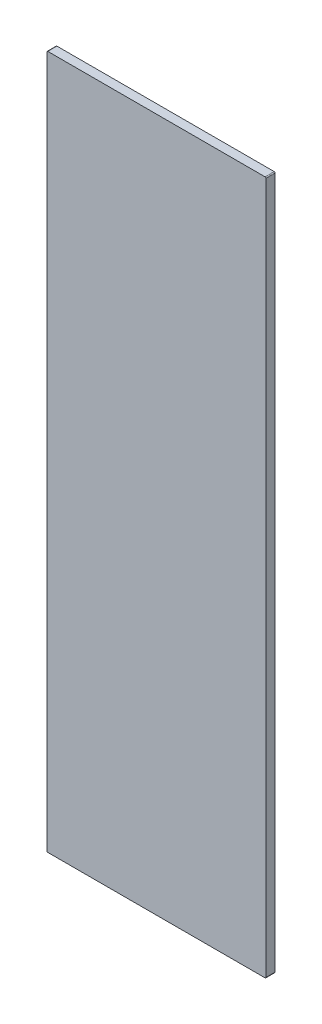
ISO-10303-21;
HEADER;
FILE_DESCRIPTION(('STEP AP214'),'2;1');
FILE_NAME('part.step','',(''),(''),'','','');
FILE_SCHEMA(('AUTOMOTIVE_DESIGN { 1 0 10303 214 1 1 1 1 }'));
ENDSEC;
DATA;
#1=APPLICATION_CONTEXT('core data for automotive mechanical design processes');
#2=APPLICATION_PROTOCOL_DEFINITION('international standard','automotive_design',2000,#1);
#3=PRODUCT_CONTEXT('',#1,'mechanical');
#4=PRODUCT('Part','Part','',(#3));
#5=PRODUCT_RELATED_PRODUCT_CATEGORY('part','',(#4));
#6=PRODUCT_DEFINITION_FORMATION('','',#4);
#7=PRODUCT_DEFINITION_CONTEXT('part definition',#1,'design');
#8=PRODUCT_DEFINITION('design','',#6,#7);
#9=PRODUCT_DEFINITION_SHAPE('','',#8);
#10=(LENGTH_UNIT() NAMED_UNIT(*) SI_UNIT(.MILLI.,.METRE.));
#11=(NAMED_UNIT(*) PLANE_ANGLE_UNIT() SI_UNIT($,.RADIAN.));
#12=(NAMED_UNIT(*) SI_UNIT($,.STERADIAN.) SOLID_ANGLE_UNIT());
#13=UNCERTAINTY_MEASURE_WITH_UNIT(LENGTH_MEASURE(1.E-05),#10,'distance_accuracy_value','');
#14=(GEOMETRIC_REPRESENTATION_CONTEXT(3) GLOBAL_UNCERTAINTY_ASSIGNED_CONTEXT((#13)) GLOBAL_UNIT_ASSIGNED_CONTEXT((#10,
#11,#12)) REPRESENTATION_CONTEXT('',''));
#15=CARTESIAN_POINT('',(0.,0.,0.));
#16=DIRECTION('',(0.,0.,1.));
#17=DIRECTION('',(1.,0.,0.));
#18=AXIS2_PLACEMENT_3D('',#15,#16,#17);
#19=CARTESIAN_POINT('',(-39.,-1.00000000000003,10.));
#20=DIRECTION('',(0.,0.,-1.));
#21=DIRECTION('',(-1.,0.,0.));
#22=AXIS2_PLACEMENT_3D('',#19,#20,#21);
#23=CYLINDRICAL_SURFACE('',#22,1.);
#24=CARTESIAN_POINT('',(-39.,-1.00000000000003,0.));
#25=DIRECTION('',(0.,0.,1.));
#26=DIRECTION('',(1.,0.,0.));
#27=AXIS2_PLACEMENT_3D('',#24,#25,#26);
#28=CIRCLE('',#27,1.);
#29=CARTESIAN_POINT('',(-39.,0.,0.));
#30=VERTEX_POINT('',#29);
#31=CARTESIAN_POINT('',(-40.,-1.00000000000003,0.));
#32=VERTEX_POINT('',#31);
#33=EDGE_CURVE('E129',#30,#32,#28,.T.);
#34=ORIENTED_EDGE('',*,*,#33,.T.);
#35=DIRECTION('',(0.,0.,-1.));
#36=VECTOR('',#35,1.);
#37=CARTESIAN_POINT('',(-40.,-1.00000000000003,10.));
#38=LINE('',#37,#36);
#39=CARTESIAN_POINT('',(-40.,-1.00000000000003,10.));
#40=VERTEX_POINT('',#39);
#41=EDGE_CURVE('E11',#40,#32,#38,.T.);
#42=ORIENTED_EDGE('',*,*,#41,.F.);
#43=CARTESIAN_POINT('',(-39.,-1.00000000000003,10.));
#44=DIRECTION('',(0.,0.,1.));
#45=DIRECTION('',(1.,0.,0.));
#46=AXIS2_PLACEMENT_3D('',#43,#44,#45);
#47=CIRCLE('',#46,1.);
#48=CARTESIAN_POINT('',(-39.,0.,10.));
#49=VERTEX_POINT('',#48);
#50=EDGE_CURVE('E143',#49,#40,#47,.T.);
#51=ORIENTED_EDGE('',*,*,#50,.F.);
#52=DIRECTION('',(0.,0.,-1.));
#53=VECTOR('',#52,1.);
#54=CARTESIAN_POINT('',(-39.,0.,10.));
#55=LINE('',#54,#53);
#56=EDGE_CURVE('E125',#49,#30,#55,.T.);
#57=ORIENTED_EDGE('',*,*,#56,.T.);
#58=EDGE_LOOP('',(#34,#42,#51,#57));
#59=FACE_BOUND('',#58,.T.);
#60=ADVANCED_FACE('F33',(#59),#23,.T.);
#61=CARTESIAN_POINT('',(-40.,-1.00000000000003,10.));
#62=DIRECTION('',(1.,0.,0.));
#63=DIRECTION('',(0.,1.,0.));
#64=AXIS2_PLACEMENT_3D('',#61,#62,#63);
#65=PLANE('',#64);
#66=DIRECTION('',(0.,-1.,0.));
#67=VECTOR('',#66,1.);
#68=CARTESIAN_POINT('',(-40.,-1.00000000000003,0.));
#69=LINE('',#68,#67);
#70=CARTESIAN_POINT('',(-39.9999999999999,-759.,0.));
#71=VERTEX_POINT('',#70);
#72=EDGE_CURVE('E132',#32,#71,#69,.T.);
#73=ORIENTED_EDGE('',*,*,#72,.T.);
#74=DIRECTION('',(0.,0.,-1.));
#75=VECTOR('',#74,1.);
#76=CARTESIAN_POINT('',(-39.9999999999999,-759.,10.));
#77=LINE('',#76,#75);
#78=CARTESIAN_POINT('',(-39.9999999999999,-759.,10.));
#79=VERTEX_POINT('',#78);
#80=EDGE_CURVE('E41',#79,#71,#77,.T.);
#81=ORIENTED_EDGE('',*,*,#80,.F.);
#82=DIRECTION('',(0.,-1.,0.));
#83=VECTOR('',#82,1.);
#84=CARTESIAN_POINT('',(-40.,-1.00000000000003,10.));
#85=LINE('',#84,#83);
#86=EDGE_CURVE('E92',#40,#79,#85,.T.);
#87=ORIENTED_EDGE('',*,*,#86,.F.);
#88=ORIENTED_EDGE('',*,*,#41,.T.);
#89=EDGE_LOOP('',(#73,#81,#87,#88));
#90=FACE_BOUND('',#89,.T.);
#91=ADVANCED_FACE('F178',(#90),#65,.F.);
#92=CARTESIAN_POINT('',(-38.9999999999999,-759.,10.));
#93=DIRECTION('',(0.,0.,-1.));
#94=DIRECTION('',(-1.,0.,0.));
#95=AXIS2_PLACEMENT_3D('',#92,#93,#94);
#96=CYLINDRICAL_SURFACE('',#95,0.999999999999997);
#97=CARTESIAN_POINT('',(-38.9999999999999,-759.,0.));
#98=DIRECTION('',(0.,0.,1.));
#99=DIRECTION('',(-1.,0.,0.));
#100=AXIS2_PLACEMENT_3D('',#97,#98,#99);
#101=CIRCLE('',#100,0.999999999999997);
#102=CARTESIAN_POINT('',(-38.9999999999999,-760.,0.));
#103=VERTEX_POINT('',#102);
#104=EDGE_CURVE('E134',#71,#103,#101,.T.);
#105=ORIENTED_EDGE('',*,*,#104,.T.);
#106=DIRECTION('',(0.,0.,-1.));
#107=VECTOR('',#106,1.);
#108=CARTESIAN_POINT('',(-38.9999999999999,-760.,10.));
#109=LINE('',#108,#107);
#110=CARTESIAN_POINT('',(-38.9999999999999,-760.,10.));
#111=VERTEX_POINT('',#110);
#112=EDGE_CURVE('E150',#111,#103,#109,.T.);
#113=ORIENTED_EDGE('',*,*,#112,.F.);
#114=CARTESIAN_POINT('',(-38.9999999999999,-759.,10.));
#115=DIRECTION('',(0.,0.,1.));
#116=DIRECTION('',(-1.,0.,0.));
#117=AXIS2_PLACEMENT_3D('',#114,#115,#116);
#118=CIRCLE('',#117,0.999999999999997);
#119=EDGE_CURVE('E158',#79,#111,#118,.T.);
#120=ORIENTED_EDGE('',*,*,#119,.F.);
#121=ORIENTED_EDGE('',*,*,#80,.T.);
#122=EDGE_LOOP('',(#105,#113,#120,#121));
#123=FACE_BOUND('',#122,.T.);
#124=ADVANCED_FACE('F156',(#123),#96,.T.);
#125=CARTESIAN_POINT('',(199.,-760.,10.));
#126=DIRECTION('',(0.,1.,0.));
#127=DIRECTION('',(0.,0.,1.));
#128=AXIS2_PLACEMENT_3D('',#125,#126,#127);
#129=PLANE('',#128);
#130=DIRECTION('',(1.,0.,0.));
#131=VECTOR('',#130,1.);
#132=CARTESIAN_POINT('',(199.,-760.,0.));
#133=LINE('',#132,#131);
#134=CARTESIAN_POINT('',(199.,-760.,0.));
#135=VERTEX_POINT('',#134);
#136=EDGE_CURVE('E136',#103,#135,#133,.T.);
#137=ORIENTED_EDGE('',*,*,#136,.T.);
#138=DIRECTION('',(0.,0.,-1.));
#139=VECTOR('',#138,1.);
#140=CARTESIAN_POINT('',(199.,-760.,10.));
#141=LINE('',#140,#139);
#142=CARTESIAN_POINT('',(199.,-760.,10.));
#143=VERTEX_POINT('',#142);
#144=EDGE_CURVE('E147',#143,#135,#141,.T.);
#145=ORIENTED_EDGE('',*,*,#144,.F.);
#146=DIRECTION('',(1.,0.,0.));
#147=VECTOR('',#146,1.);
#148=CARTESIAN_POINT('',(199.,-760.,10.));
#149=LINE('',#148,#147);
#150=EDGE_CURVE('E170',#111,#143,#149,.T.);
#151=ORIENTED_EDGE('',*,*,#150,.F.);
#152=ORIENTED_EDGE('',*,*,#112,.T.);
#153=EDGE_LOOP('',(#137,#145,#151,#152));
#154=FACE_BOUND('',#153,.T.);
#155=ADVANCED_FACE('F166',(#154),#129,.F.);
#156=CARTESIAN_POINT('',(199.,-759.,10.));
#157=DIRECTION('',(0.,0.,-1.));
#158=DIRECTION('',(-1.,0.,0.));
#159=AXIS2_PLACEMENT_3D('',#156,#157,#158);
#160=CYLINDRICAL_SURFACE('',#159,0.999999999999987);
#161=CARTESIAN_POINT('',(199.,-759.,0.));
#162=DIRECTION('',(0.,0.,1.));
#163=DIRECTION('',(-1.,0.,0.));
#164=AXIS2_PLACEMENT_3D('',#161,#162,#163);
#165=CIRCLE('',#164,0.999999999999987);
#166=CARTESIAN_POINT('',(200.,-759.,0.));
#167=VERTEX_POINT('',#166);
#168=EDGE_CURVE('E138',#135,#167,#165,.T.);
#169=ORIENTED_EDGE('',*,*,#168,.T.);
#170=DIRECTION('',(0.,0.,-1.));
#171=VECTOR('',#170,1.);
#172=CARTESIAN_POINT('',(200.,-759.,10.));
#173=LINE('',#172,#171);
#174=CARTESIAN_POINT('',(200.,-759.,10.));
#175=VERTEX_POINT('',#174);
#176=EDGE_CURVE('E120',#175,#167,#173,.T.);
#177=ORIENTED_EDGE('',*,*,#176,.F.);
#178=CARTESIAN_POINT('',(199.,-759.,10.));
#179=DIRECTION('',(0.,0.,1.));
#180=DIRECTION('',(-1.,0.,0.));
#181=AXIS2_PLACEMENT_3D('',#178,#179,#180);
#182=CIRCLE('',#181,0.999999999999987);
#183=EDGE_CURVE('E111',#143,#175,#182,.T.);
#184=ORIENTED_EDGE('',*,*,#183,.F.);
#185=ORIENTED_EDGE('',*,*,#144,.T.);
#186=EDGE_LOOP('',(#169,#177,#184,#185));
#187=FACE_BOUND('',#186,.T.);
#188=ADVANCED_FACE('F169',(#187),#160,.T.);
#189=CARTESIAN_POINT('',(200.,-1.,10.));
#190=DIRECTION('',(-1.,0.,0.));
#191=DIRECTION('',(0.,-1.,0.));
#192=AXIS2_PLACEMENT_3D('',#189,#190,#191);
#193=PLANE('',#192);
#194=DIRECTION('',(0.,1.,0.));
#195=VECTOR('',#194,1.);
#196=CARTESIAN_POINT('',(200.,-1.,0.));
#197=LINE('',#196,#195);
#198=CARTESIAN_POINT('',(200.,-1.,0.));
#199=VERTEX_POINT('',#198);
#200=EDGE_CURVE('E119',#167,#199,#197,.T.);
#201=ORIENTED_EDGE('',*,*,#200,.T.);
#202=DIRECTION('',(0.,0.,-1.));
#203=VECTOR('',#202,1.);
#204=CARTESIAN_POINT('',(200.,-1.,10.));
#205=LINE('',#204,#203);
#206=CARTESIAN_POINT('',(200.,-1.,10.));
#207=VERTEX_POINT('',#206);
#208=EDGE_CURVE('E116',#207,#199,#205,.T.);
#209=ORIENTED_EDGE('',*,*,#208,.F.);
#210=DIRECTION('',(0.,1.,0.));
#211=VECTOR('',#210,1.);
#212=CARTESIAN_POINT('',(200.,-1.,10.));
#213=LINE('',#212,#211);
#214=EDGE_CURVE('E105',#175,#207,#213,.T.);
#215=ORIENTED_EDGE('',*,*,#214,.F.);
#216=ORIENTED_EDGE('',*,*,#176,.T.);
#217=EDGE_LOOP('',(#201,#209,#215,#216));
#218=FACE_BOUND('',#217,.T.);
#219=ADVANCED_FACE('F117',(#218),#193,.F.);
#220=CARTESIAN_POINT('',(199.,-1.,10.));
#221=DIRECTION('',(0.,0.,-1.));
#222=DIRECTION('',(-1.,0.,0.));
#223=AXIS2_PLACEMENT_3D('',#220,#221,#222);
#224=CYLINDRICAL_SURFACE('',#223,1.);
#225=CARTESIAN_POINT('',(199.,-1.,0.));
#226=DIRECTION('',(0.,0.,1.));
#227=DIRECTION('',(-1.,0.,0.));
#228=AXIS2_PLACEMENT_3D('',#225,#226,#227);
#229=CIRCLE('',#228,1.);
#230=CARTESIAN_POINT('',(199.,0.,0.));
#231=VERTEX_POINT('',#230);
#232=EDGE_CURVE('E78',#199,#231,#229,.T.);
#233=ORIENTED_EDGE('',*,*,#232,.T.);
#234=DIRECTION('',(0.,0.,-1.));
#235=VECTOR('',#234,1.);
#236=CARTESIAN_POINT('',(199.,0.,10.));
#237=LINE('',#236,#235);
#238=CARTESIAN_POINT('',(199.,0.,10.));
#239=VERTEX_POINT('',#238);
#240=EDGE_CURVE('E121',#239,#231,#237,.T.);
#241=ORIENTED_EDGE('',*,*,#240,.F.);
#242=CARTESIAN_POINT('',(199.,-1.,10.));
#243=DIRECTION('',(0.,0.,1.));
#244=DIRECTION('',(-1.,0.,0.));
#245=AXIS2_PLACEMENT_3D('',#242,#243,#244);
#246=CIRCLE('',#245,1.);
#247=EDGE_CURVE('E109',#207,#239,#246,.T.);
#248=ORIENTED_EDGE('',*,*,#247,.F.);
#249=ORIENTED_EDGE('',*,*,#208,.T.);
#250=EDGE_LOOP('',(#233,#241,#248,#249));
#251=FACE_BOUND('',#250,.T.);
#252=ADVANCED_FACE('F123',(#251),#224,.T.);
#253=CARTESIAN_POINT('',(199.,0.,10.));
#254=DIRECTION('',(0.,-1.,0.));
#255=DIRECTION('',(1.,0.,0.));
#256=AXIS2_PLACEMENT_3D('',#253,#254,#255);
#257=PLANE('',#256);
#258=DIRECTION('',(-1.,0.,0.));
#259=VECTOR('',#258,1.);
#260=CARTESIAN_POINT('',(199.,0.,0.));
#261=LINE('',#260,#259);
#262=EDGE_CURVE('E84',#231,#30,#261,.T.);
#263=ORIENTED_EDGE('',*,*,#262,.T.);
#264=ORIENTED_EDGE('',*,*,#56,.F.);
#265=DIRECTION('',(-1.,0.,0.));
#266=VECTOR('',#265,1.);
#267=CARTESIAN_POINT('',(199.,0.,10.));
#268=LINE('',#267,#266);
#269=EDGE_CURVE('E49',#239,#49,#268,.T.);
#270=ORIENTED_EDGE('',*,*,#269,.F.);
#271=ORIENTED_EDGE('',*,*,#240,.T.);
#272=EDGE_LOOP('',(#263,#264,#270,#271));
#273=FACE_BOUND('',#272,.T.);
#274=ADVANCED_FACE('F194',(#273),#257,.F.);
#275=CARTESIAN_POINT('',(-39.,-1.00000000000003,10.));
#276=DIRECTION('',(0.,0.,1.));
#277=DIRECTION('',(1.,0.,0.));
#278=AXIS2_PLACEMENT_3D('',#275,#276,#277);
#279=PLANE('',#278);
#280=ORIENTED_EDGE('',*,*,#50,.T.);
#281=ORIENTED_EDGE('',*,*,#86,.T.);
#282=ORIENTED_EDGE('',*,*,#119,.T.);
#283=ORIENTED_EDGE('',*,*,#150,.T.);
#284=ORIENTED_EDGE('',*,*,#183,.T.);
#285=ORIENTED_EDGE('',*,*,#214,.T.);
#286=ORIENTED_EDGE('',*,*,#247,.T.);
#287=ORIENTED_EDGE('',*,*,#269,.T.);
#288=EDGE_LOOP('',(#280,#281,#282,#283,#284,#285,#286,#287));
#289=FACE_BOUND('',#288,.T.);
#290=ADVANCED_FACE('F107',(#289),#279,.T.);
#291=CARTESIAN_POINT('',(-39.,-1.00000000000003,0.));
#292=DIRECTION('',(0.,0.,1.));
#293=DIRECTION('',(1.,0.,0.));
#294=AXIS2_PLACEMENT_3D('',#291,#292,#293);
#295=PLANE('',#294);
#296=ORIENTED_EDGE('',*,*,#33,.F.);
#297=ORIENTED_EDGE('',*,*,#262,.F.);
#298=ORIENTED_EDGE('',*,*,#232,.F.);
#299=ORIENTED_EDGE('',*,*,#200,.F.);
#300=ORIENTED_EDGE('',*,*,#168,.F.);
#301=ORIENTED_EDGE('',*,*,#136,.F.);
#302=ORIENTED_EDGE('',*,*,#104,.F.);
#303=ORIENTED_EDGE('',*,*,#72,.F.);
#304=EDGE_LOOP('',(#296,#297,#298,#299,#300,#301,#302,#303));
#305=FACE_BOUND('',#304,.T.);
#306=ADVANCED_FACE('F162',(#305),#295,.F.);
#307=CLOSED_SHELL('',(#60,#91,#124,#155,#188,#219,#252,#274,#290,#306));
#308=MANIFOLD_SOLID_BREP('B2',#307);
#309=ADVANCED_BREP_SHAPE_REPRESENTATION('',(#18,#308),#14);
#310=SHAPE_DEFINITION_REPRESENTATION(#9,#309);
ENDSEC;
END-ISO-10303-21;
